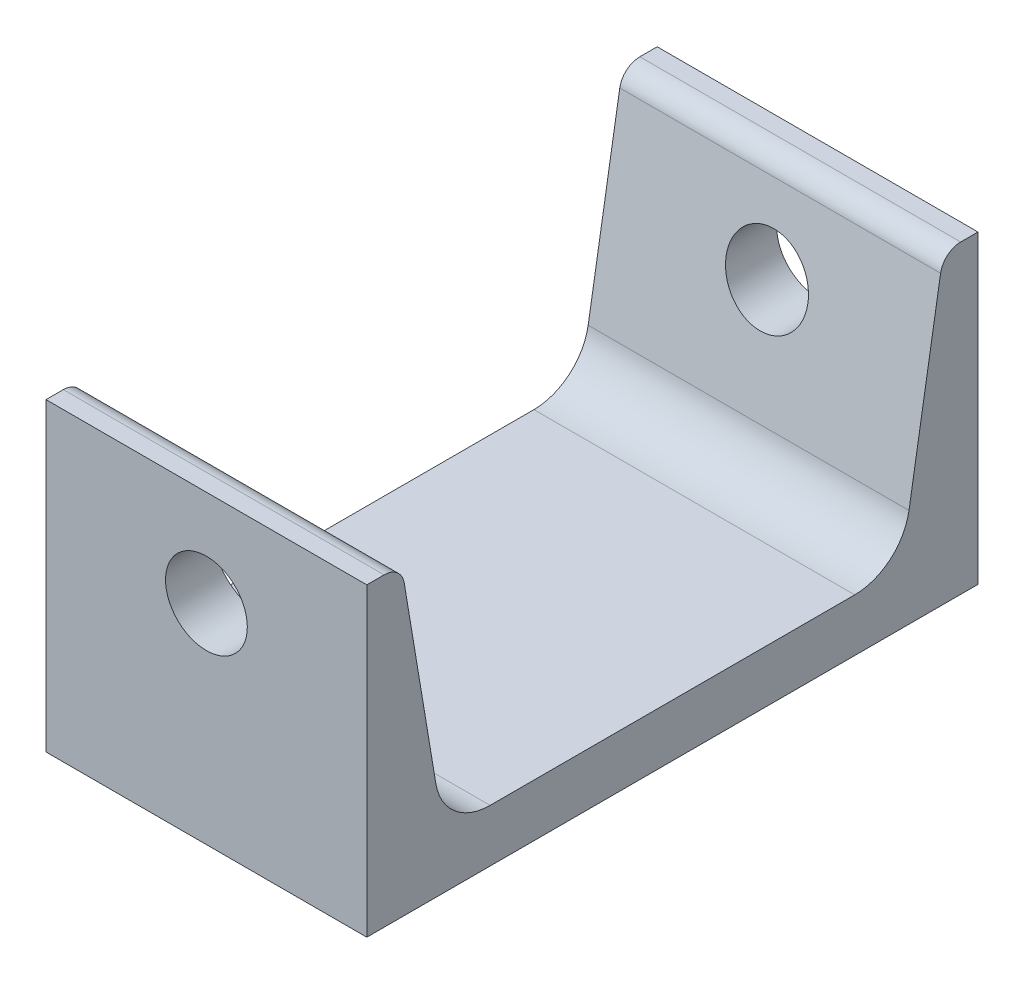
ISO-10303-21;
HEADER;
FILE_DESCRIPTION(('STEP AP214'),'2;1');
FILE_NAME('part.step','',(''),(''),'','','');
FILE_SCHEMA(('AUTOMOTIVE_DESIGN { 1 0 10303 214 1 1 1 1 }'));
ENDSEC;
DATA;
#1=APPLICATION_CONTEXT('core data for automotive mechanical design processes');
#2=APPLICATION_PROTOCOL_DEFINITION('international standard','automotive_design',2000,#1);
#3=PRODUCT_CONTEXT('',#1,'mechanical');
#4=PRODUCT('Part','Part','',(#3));
#5=PRODUCT_RELATED_PRODUCT_CATEGORY('part','',(#4));
#6=PRODUCT_DEFINITION_FORMATION('','',#4);
#7=PRODUCT_DEFINITION_CONTEXT('part definition',#1,'design');
#8=PRODUCT_DEFINITION('design','',#6,#7);
#9=PRODUCT_DEFINITION_SHAPE('','',#8);
#10=(LENGTH_UNIT() NAMED_UNIT(*) SI_UNIT(.MILLI.,.METRE.));
#11=(NAMED_UNIT(*) PLANE_ANGLE_UNIT() SI_UNIT($,.RADIAN.));
#12=(NAMED_UNIT(*) SI_UNIT($,.STERADIAN.) SOLID_ANGLE_UNIT());
#13=UNCERTAINTY_MEASURE_WITH_UNIT(LENGTH_MEASURE(1.E-05),#10,'distance_accuracy_value','');
#14=(GEOMETRIC_REPRESENTATION_CONTEXT(3) GLOBAL_UNCERTAINTY_ASSIGNED_CONTEXT((#13)) GLOBAL_UNIT_ASSIGNED_CONTEXT((#10,
#11,#12)) REPRESENTATION_CONTEXT('',''));
#15=CARTESIAN_POINT('',(0.,0.,0.));
#16=DIRECTION('',(0.,0.,1.));
#17=DIRECTION('',(1.,0.,0.));
#18=AXIS2_PLACEMENT_3D('',#15,#16,#17);
#19=CARTESIAN_POINT('',(21.463345864662,0.,-38.1));
#20=DIRECTION('',(0.,0.,1.));
#21=DIRECTION('',(1.,0.,0.));
#22=AXIS2_PLACEMENT_3D('',#19,#20,#21);
#23=PLANE('',#22);
#24=CARTESIAN_POINT('',(1.46334586466201,26.0492,-38.1));
#25=DIRECTION('',(0.,0.,1.));
#26=DIRECTION('',(1.,0.,0.));
#27=AXIS2_PLACEMENT_3D('',#24,#25,#26);
#28=CIRCLE('',#27,5.1);
#29=CARTESIAN_POINT('',(6.56334586466201,26.0492,-38.1));
#30=VERTEX_POINT('',#29);
#31=EDGE_CURVE('E308',#30,#30,#28,.T.);
#32=ORIENTED_EDGE('',*,*,#31,.T.);
#33=EDGE_LOOP('',(#32));
#34=FACE_BOUND('',#33,.T.);
#35=DIRECTION('',(0.,1.,0.));
#36=VECTOR('',#35,1.);
#37=CARTESIAN_POINT('',(-18.5366541353384,0.,-38.1));
#38=LINE('',#37,#36);
#39=CARTESIAN_POINT('',(-18.5366541353384,0.,-38.1));
#40=VERTEX_POINT('',#39);
#41=CARTESIAN_POINT('',(-18.5366541353384,38.0492,-38.1));
#42=VERTEX_POINT('',#41);
#43=EDGE_CURVE('E199',#40,#42,#38,.T.);
#44=ORIENTED_EDGE('',*,*,#43,.T.);
#45=DIRECTION('',(-1.,0.,0.));
#46=VECTOR('',#45,1.);
#47=CARTESIAN_POINT('',(21.463345864662,38.0492,-38.1));
#48=LINE('',#47,#46);
#49=CARTESIAN_POINT('',(21.463345864662,38.0492,-38.1));
#50=VERTEX_POINT('',#49);
#51=EDGE_CURVE('E13',#50,#42,#48,.T.);
#52=ORIENTED_EDGE('',*,*,#51,.F.);
#53=DIRECTION('',(0.,1.,0.));
#54=VECTOR('',#53,1.);
#55=CARTESIAN_POINT('',(21.463345864662,0.,-38.1));
#56=LINE('',#55,#54);
#57=CARTESIAN_POINT('',(21.463345864662,0.,-38.1));
#58=VERTEX_POINT('',#57);
#59=EDGE_CURVE('E222',#58,#50,#56,.T.);
#60=ORIENTED_EDGE('',*,*,#59,.F.);
#61=DIRECTION('',(-1.,0.,0.));
#62=VECTOR('',#61,1.);
#63=CARTESIAN_POINT('',(21.463345864662,0.,-38.1));
#64=LINE('',#63,#62);
#65=EDGE_CURVE('E195',#58,#40,#64,.T.);
#66=ORIENTED_EDGE('',*,*,#65,.T.);
#67=EDGE_LOOP('',(#44,#52,#60,#66));
#68=FACE_BOUND('',#67,.T.);
#69=ADVANCED_FACE('F79',(#34,#68),#23,.F.);
#70=CARTESIAN_POINT('',(21.463345864662,38.0492,-38.1));
#71=DIRECTION('',(0.,-1.,0.));
#72=DIRECTION('',(0.,0.,-1.));
#73=AXIS2_PLACEMENT_3D('',#70,#71,#72);
#74=PLANE('',#73);
#75=DIRECTION('',(0.,0.,1.));
#76=VECTOR('',#75,1.);
#77=CARTESIAN_POINT('',(-18.5366541353384,38.0492,-38.1));
#78=LINE('',#77,#76);
#79=CARTESIAN_POINT('',(-18.5366541353384,38.0492,-35.942335135838));
#80=VERTEX_POINT('',#79);
#81=EDGE_CURVE('E202',#42,#80,#78,.T.);
#82=ORIENTED_EDGE('',*,*,#81,.T.);
#83=DIRECTION('',(-1.,0.,0.));
#84=VECTOR('',#83,1.);
#85=CARTESIAN_POINT('',(21.463345864662,38.0492,-35.942335135838));
#86=LINE('',#85,#84);
#87=CARTESIAN_POINT('',(21.463345864662,38.0492,-35.942335135838));
#88=VERTEX_POINT('',#87);
#89=EDGE_CURVE('E87',#88,#80,#86,.T.);
#90=ORIENTED_EDGE('',*,*,#89,.F.);
#91=DIRECTION('',(0.,0.,1.));
#92=VECTOR('',#91,1.);
#93=CARTESIAN_POINT('',(21.463345864662,38.0492,-38.1));
#94=LINE('',#93,#92);
#95=EDGE_CURVE('E150',#50,#88,#94,.T.);
#96=ORIENTED_EDGE('',*,*,#95,.F.);
#97=ORIENTED_EDGE('',*,*,#51,.T.);
#98=EDGE_LOOP('',(#82,#90,#96,#97));
#99=FACE_BOUND('',#98,.T.);
#100=ADVANCED_FACE('F301',(#99),#74,.F.);
#101=CARTESIAN_POINT('',(21.463345864662,35.5092,-35.942335135838));
#102=DIRECTION('',(-1.,0.,0.));
#103=DIRECTION('',(0.,0.,1.));
#104=AXIS2_PLACEMENT_3D('',#101,#102,#103);
#105=CYLINDRICAL_SURFACE('',#104,2.54);
#106=CARTESIAN_POINT('',(-18.5366541353384,35.5092,-35.942335135838));
#107=DIRECTION('',(1.,0.,0.));
#108=DIRECTION('',(0.,0.,-1.));
#109=AXIS2_PLACEMENT_3D('',#106,#107,#108);
#110=CIRCLE('',#109,2.54);
#111=CARTESIAN_POINT('',(-18.5366541353384,35.9268030663407,-33.4368995092487));
#112=VERTEX_POINT('',#111);
#113=EDGE_CURVE('E205',#80,#112,#110,.T.);
#114=ORIENTED_EDGE('',*,*,#113,.T.);
#115=DIRECTION('',(-1.,0.,0.));
#116=VECTOR('',#115,1.);
#117=CARTESIAN_POINT('',(21.463345864662,35.9268030663407,-33.4368995092487));
#118=LINE('',#117,#116);
#119=CARTESIAN_POINT('',(21.463345864662,35.9268030663407,-33.4368995092487));
#120=VERTEX_POINT('',#119);
#121=EDGE_CURVE('E241',#120,#112,#118,.T.);
#122=ORIENTED_EDGE('',*,*,#121,.F.);
#123=CARTESIAN_POINT('',(21.463345864662,35.5092,-35.942335135838));
#124=DIRECTION('',(1.,0.,0.));
#125=DIRECTION('',(0.,0.,-1.));
#126=AXIS2_PLACEMENT_3D('',#123,#124,#125);
#127=CIRCLE('',#126,2.54);
#128=EDGE_CURVE('E249',#88,#120,#127,.T.);
#129=ORIENTED_EDGE('',*,*,#128,.F.);
#130=ORIENTED_EDGE('',*,*,#89,.T.);
#131=EDGE_LOOP('',(#114,#122,#129,#130));
#132=FACE_BOUND('',#131,.T.);
#133=ADVANCED_FACE('F247',(#132),#105,.T.);
#134=CARTESIAN_POINT('',(21.463345864662,12.2836717208802,-29.4960901573836));
#135=DIRECTION('',(0.,-0.164410656039629,-0.986391978972162));
#136=DIRECTION('',(0.,0.986391978972162,-0.164410656039629));
#137=AXIS2_PLACEMENT_3D('',#134,#135,#136);
#138=PLANE('',#137);
#139=CARTESIAN_POINT('',(1.46334586466201,26.0492,-31.7905122363835));
#140=DIRECTION('',(0.,-0.164410656039629,-0.986391978972162));
#141=DIRECTION('',(0.,-0.986391978972162,0.164410656039629));
#142=AXIS2_PLACEMENT_3D('',#139,#140,#141);
#143=ELLIPSE('',#142,5.17035834508132,5.1);
#144=CARTESIAN_POINT('',(1.46334586466201,20.9492,-30.9404502289087));
#145=VERTEX_POINT('',#144);
#146=EDGE_CURVE('E203',#145,#145,#143,.T.);
#147=ORIENTED_EDGE('',*,*,#146,.T.);
#148=EDGE_LOOP('',(#147));
#149=FACE_BOUND('',#148,.T.);
#150=DIRECTION('',(0.,-0.986391978972162,0.164410656039629));
#151=VECTOR('',#150,1.);
#152=CARTESIAN_POINT('',(-18.5366541353384,12.2836717208802,-29.4960901573836));
#153=LINE('',#152,#151);
#154=CARTESIAN_POINT('',(-18.5366541353384,12.2836717208802,-29.4960901573836));
#155=VERTEX_POINT('',#154);
#156=EDGE_CURVE('E207',#112,#155,#153,.T.);
#157=ORIENTED_EDGE('',*,*,#156,.T.);
#158=DIRECTION('',(-1.,0.,0.));
#159=VECTOR('',#158,1.);
#160=CARTESIAN_POINT('',(21.463345864662,12.2836717208802,-29.4960901573836));
#161=LINE('',#160,#159);
#162=CARTESIAN_POINT('',(21.463345864662,12.2836717208802,-29.4960901573836));
#163=VERTEX_POINT('',#162);
#164=EDGE_CURVE('E238',#163,#155,#161,.T.);
#165=ORIENTED_EDGE('',*,*,#164,.F.);
#166=DIRECTION('',(0.,-0.986391978972162,0.164410656039629));
#167=VECTOR('',#166,1.);
#168=CARTESIAN_POINT('',(21.463345864662,12.2836717208802,-29.4960901573836));
#169=LINE('',#168,#167);
#170=EDGE_CURVE('E267',#120,#163,#169,.T.);
#171=ORIENTED_EDGE('',*,*,#170,.F.);
#172=ORIENTED_EDGE('',*,*,#121,.T.);
#173=EDGE_LOOP('',(#157,#165,#171,#172));
#174=FACE_BOUND('',#173,.T.);
#175=ADVANCED_FACE('F258',(#149,#174),#138,.F.);
#176=CARTESIAN_POINT('',(21.463345864662,13.4112,-22.7314139655925));
#177=DIRECTION('',(-1.,0.,0.));
#178=DIRECTION('',(0.,0.,1.));
#179=AXIS2_PLACEMENT_3D('',#176,#177,#178);
#180=CYLINDRICAL_SURFACE('',#179,6.85800000000001);
#181=CARTESIAN_POINT('',(-18.5366541353384,13.4112,-22.7314139655925));
#182=DIRECTION('',(-1.,0.,0.));
#183=DIRECTION('',(0.,0.,-1.));
#184=AXIS2_PLACEMENT_3D('',#181,#182,#183);
#185=CIRCLE('',#184,6.85800000000001);
#186=CARTESIAN_POINT('',(-18.5366541353384,6.55320000000001,-22.7314139655925));
#187=VERTEX_POINT('',#186);
#188=EDGE_CURVE('E209',#155,#187,#185,.T.);
#189=ORIENTED_EDGE('',*,*,#188,.T.);
#190=DIRECTION('',(-1.,0.,0.));
#191=VECTOR('',#190,1.);
#192=CARTESIAN_POINT('',(21.463345864662,6.55320000000001,-22.7314139655925));
#193=LINE('',#192,#191);
#194=CARTESIAN_POINT('',(21.463345864662,6.55320000000001,-22.7314139655925));
#195=VERTEX_POINT('',#194);
#196=EDGE_CURVE('E235',#195,#187,#193,.T.);
#197=ORIENTED_EDGE('',*,*,#196,.F.);
#198=CARTESIAN_POINT('',(21.463345864662,13.4112,-22.7314139655925));
#199=DIRECTION('',(-1.,0.,0.));
#200=DIRECTION('',(0.,0.,-1.));
#201=AXIS2_PLACEMENT_3D('',#198,#199,#200);
#202=CIRCLE('',#201,6.85800000000001);
#203=EDGE_CURVE('E264',#163,#195,#202,.T.);
#204=ORIENTED_EDGE('',*,*,#203,.F.);
#205=ORIENTED_EDGE('',*,*,#164,.T.);
#206=EDGE_LOOP('',(#189,#197,#204,#205));
#207=FACE_BOUND('',#206,.T.);
#208=ADVANCED_FACE('F262',(#207),#180,.F.);
#209=CARTESIAN_POINT('',(21.463345864662,6.55320000000001,22.7314139655925));
#210=DIRECTION('',(0.,-1.,0.));
#211=DIRECTION('',(0.,0.,-1.));
#212=AXIS2_PLACEMENT_3D('',#209,#210,#211);
#213=PLANE('',#212);
#214=DIRECTION('',(0.,0.,1.));
#215=VECTOR('',#214,1.);
#216=CARTESIAN_POINT('',(-18.5366541353384,6.55320000000001,22.7314139655925));
#217=LINE('',#216,#215);
#218=CARTESIAN_POINT('',(-18.5366541353384,6.5532,22.7314139655925));
#219=VERTEX_POINT('',#218);
#220=EDGE_CURVE('E211',#187,#219,#217,.T.);
#221=ORIENTED_EDGE('',*,*,#220,.T.);
#222=DIRECTION('',(-1.,0.,0.));
#223=VECTOR('',#222,1.);
#224=CARTESIAN_POINT('',(21.463345864662,6.5532,22.7314139655925));
#225=LINE('',#224,#223);
#226=CARTESIAN_POINT('',(21.463345864662,6.5532,22.7314139655925));
#227=VERTEX_POINT('',#226);
#228=EDGE_CURVE('E232',#227,#219,#225,.T.);
#229=ORIENTED_EDGE('',*,*,#228,.F.);
#230=DIRECTION('',(0.,0.,1.));
#231=VECTOR('',#230,1.);
#232=CARTESIAN_POINT('',(21.463345864662,6.55320000000001,22.7314139655925));
#233=LINE('',#232,#231);
#234=EDGE_CURVE('E266',#195,#227,#233,.T.);
#235=ORIENTED_EDGE('',*,*,#234,.F.);
#236=ORIENTED_EDGE('',*,*,#196,.T.);
#237=EDGE_LOOP('',(#221,#229,#235,#236));
#238=FACE_BOUND('',#237,.T.);
#239=ADVANCED_FACE('F412',(#238),#213,.F.);
#240=CARTESIAN_POINT('',(21.463345864662,13.4112,22.7314139655925));
#241=DIRECTION('',(-1.,0.,0.));
#242=DIRECTION('',(0.,0.,1.));
#243=AXIS2_PLACEMENT_3D('',#240,#241,#242);
#244=CYLINDRICAL_SURFACE('',#243,6.85800000000001);
#245=CARTESIAN_POINT('',(-18.5366541353384,13.4112,22.7314139655925));
#246=DIRECTION('',(-1.,0.,0.));
#247=DIRECTION('',(0.,0.,1.));
#248=AXIS2_PLACEMENT_3D('',#245,#246,#247);
#249=CIRCLE('',#248,6.85800000000001);
#250=CARTESIAN_POINT('',(-18.5366541353384,12.2836717208802,29.4960901573836));
#251=VERTEX_POINT('',#250);
#252=EDGE_CURVE('E213',#219,#251,#249,.T.);
#253=ORIENTED_EDGE('',*,*,#252,.T.);
#254=DIRECTION('',(-1.,0.,0.));
#255=VECTOR('',#254,1.);
#256=CARTESIAN_POINT('',(21.463345864662,12.2836717208802,29.4960901573836));
#257=LINE('',#256,#255);
#258=CARTESIAN_POINT('',(21.463345864662,12.2836717208802,29.4960901573836));
#259=VERTEX_POINT('',#258);
#260=EDGE_CURVE('E229',#259,#251,#257,.T.);
#261=ORIENTED_EDGE('',*,*,#260,.F.);
#262=CARTESIAN_POINT('',(21.463345864662,13.4112,22.7314139655925));
#263=DIRECTION('',(-1.,0.,0.));
#264=DIRECTION('',(0.,0.,1.));
#265=AXIS2_PLACEMENT_3D('',#262,#263,#264);
#266=CIRCLE('',#265,6.85800000000001);
#267=EDGE_CURVE('E269',#227,#259,#266,.T.);
#268=ORIENTED_EDGE('',*,*,#267,.F.);
#269=ORIENTED_EDGE('',*,*,#228,.T.);
#270=EDGE_LOOP('',(#253,#261,#268,#269));
#271=FACE_BOUND('',#270,.T.);
#272=ADVANCED_FACE('F364',(#271),#244,.F.);
#273=CARTESIAN_POINT('',(21.463345864662,12.2836717208802,29.4960901573836));
#274=DIRECTION('',(0.,-0.164410656039629,0.986391978972162));
#275=DIRECTION('',(0.,-0.986391978972162,-0.164410656039629));
#276=AXIS2_PLACEMENT_3D('',#273,#274,#275);
#277=PLANE('',#276);
#278=CARTESIAN_POINT('',(1.46334586466201,26.0492,31.7905122363835));
#279=DIRECTION('',(0.,-0.164410656039629,0.986391978972162));
#280=DIRECTION('',(0.,0.986391978972162,0.164410656039629));
#281=AXIS2_PLACEMENT_3D('',#278,#279,#280);
#282=ELLIPSE('',#281,5.17035834508132,5.1);
#283=CARTESIAN_POINT('',(1.46334586466201,31.1492,32.6405742438583));
#284=VERTEX_POINT('',#283);
#285=EDGE_CURVE('E310',#284,#284,#282,.T.);
#286=ORIENTED_EDGE('',*,*,#285,.T.);
#287=EDGE_LOOP('',(#286));
#288=FACE_BOUND('',#287,.T.);
#289=DIRECTION('',(0.,0.986391978972162,0.164410656039629));
#290=VECTOR('',#289,1.);
#291=CARTESIAN_POINT('',(-18.5366541353384,12.2836717208802,29.4960901573836));
#292=LINE('',#291,#290);
#293=CARTESIAN_POINT('',(-18.5366541353384,35.9268030663407,33.4368995092487));
#294=VERTEX_POINT('',#293);
#295=EDGE_CURVE('E215',#251,#294,#292,.T.);
#296=ORIENTED_EDGE('',*,*,#295,.T.);
#297=DIRECTION('',(-1.,0.,0.));
#298=VECTOR('',#297,1.);
#299=CARTESIAN_POINT('',(21.463345864662,35.9268030663407,33.4368995092487));
#300=LINE('',#299,#298);
#301=CARTESIAN_POINT('',(21.463345864662,35.9268030663407,33.4368995092487));
#302=VERTEX_POINT('',#301);
#303=EDGE_CURVE('E226',#302,#294,#300,.T.);
#304=ORIENTED_EDGE('',*,*,#303,.F.);
#305=DIRECTION('',(0.,0.986391978972162,0.164410656039629));
#306=VECTOR('',#305,1.);
#307=CARTESIAN_POINT('',(21.463345864662,12.2836717208802,29.4960901573836));
#308=LINE('',#307,#306);
#309=EDGE_CURVE('E275',#259,#302,#308,.T.);
#310=ORIENTED_EDGE('',*,*,#309,.F.);
#311=ORIENTED_EDGE('',*,*,#260,.T.);
#312=EDGE_LOOP('',(#296,#304,#310,#311));
#313=FACE_BOUND('',#312,.T.);
#314=ADVANCED_FACE('F281',(#288,#313),#277,.F.);
#315=CARTESIAN_POINT('',(21.463345864662,35.5092,35.942335135838));
#316=DIRECTION('',(-1.,0.,0.));
#317=DIRECTION('',(0.,0.,1.));
#318=AXIS2_PLACEMENT_3D('',#315,#316,#317);
#319=CYLINDRICAL_SURFACE('',#318,2.54);
#320=CARTESIAN_POINT('',(-18.5366541353384,35.5092,35.942335135838));
#321=DIRECTION('',(1.,0.,0.));
#322=DIRECTION('',(0.,0.,1.));
#323=AXIS2_PLACEMENT_3D('',#320,#321,#322);
#324=CIRCLE('',#323,2.54);
#325=CARTESIAN_POINT('',(-18.5366541353384,38.0492,35.942335135838));
#326=VERTEX_POINT('',#325);
#327=EDGE_CURVE('E217',#294,#326,#324,.T.);
#328=ORIENTED_EDGE('',*,*,#327,.T.);
#329=DIRECTION('',(-1.,0.,0.));
#330=VECTOR('',#329,1.);
#331=CARTESIAN_POINT('',(21.463345864662,38.0492,35.942335135838));
#332=LINE('',#331,#330);
#333=CARTESIAN_POINT('',(21.463345864662,38.0492,35.942335135838));
#334=VERTEX_POINT('',#333);
#335=EDGE_CURVE('E190',#334,#326,#332,.T.);
#336=ORIENTED_EDGE('',*,*,#335,.F.);
#337=CARTESIAN_POINT('',(21.463345864662,35.5092,35.942335135838));
#338=DIRECTION('',(1.,0.,0.));
#339=DIRECTION('',(0.,0.,1.));
#340=AXIS2_PLACEMENT_3D('',#337,#338,#339);
#341=CIRCLE('',#340,2.54);
#342=EDGE_CURVE('E181',#302,#334,#341,.T.);
#343=ORIENTED_EDGE('',*,*,#342,.F.);
#344=ORIENTED_EDGE('',*,*,#303,.T.);
#345=EDGE_LOOP('',(#328,#336,#343,#344));
#346=FACE_BOUND('',#345,.T.);
#347=ADVANCED_FACE('F285',(#346),#319,.T.);
#348=CARTESIAN_POINT('',(21.463345864662,38.0492,38.1));
#349=DIRECTION('',(0.,-1.,0.));
#350=DIRECTION('',(0.,0.,-1.));
#351=AXIS2_PLACEMENT_3D('',#348,#349,#350);
#352=PLANE('',#351);
#353=DIRECTION('',(0.,0.,1.));
#354=VECTOR('',#353,1.);
#355=CARTESIAN_POINT('',(-18.5366541353384,38.0492,38.1));
#356=LINE('',#355,#354);
#357=CARTESIAN_POINT('',(-18.5366541353384,38.0492,38.1));
#358=VERTEX_POINT('',#357);
#359=EDGE_CURVE('E189',#326,#358,#356,.T.);
#360=ORIENTED_EDGE('',*,*,#359,.T.);
#361=DIRECTION('',(-1.,0.,0.));
#362=VECTOR('',#361,1.);
#363=CARTESIAN_POINT('',(21.463345864662,38.0492,38.1));
#364=LINE('',#363,#362);
#365=CARTESIAN_POINT('',(21.463345864662,38.0492,38.1));
#366=VERTEX_POINT('',#365);
#367=EDGE_CURVE('E186',#366,#358,#364,.T.);
#368=ORIENTED_EDGE('',*,*,#367,.F.);
#369=DIRECTION('',(0.,0.,1.));
#370=VECTOR('',#369,1.);
#371=CARTESIAN_POINT('',(21.463345864662,38.0492,38.1));
#372=LINE('',#371,#370);
#373=EDGE_CURVE('E175',#334,#366,#372,.T.);
#374=ORIENTED_EDGE('',*,*,#373,.F.);
#375=ORIENTED_EDGE('',*,*,#335,.T.);
#376=EDGE_LOOP('',(#360,#368,#374,#375));
#377=FACE_BOUND('',#376,.T.);
#378=ADVANCED_FACE('F187',(#377),#352,.F.);
#379=CARTESIAN_POINT('',(21.463345864662,0.,38.1));
#380=DIRECTION('',(0.,0.,-1.));
#381=DIRECTION('',(-1.,0.,0.));
#382=AXIS2_PLACEMENT_3D('',#379,#380,#381);
#383=PLANE('',#382);
#384=CARTESIAN_POINT('',(1.46334586466201,26.0492,38.1));
#385=DIRECTION('',(0.,0.,1.));
#386=DIRECTION('',(1.,0.,0.));
#387=AXIS2_PLACEMENT_3D('',#384,#385,#386);
#388=CIRCLE('',#387,5.1);
#389=CARTESIAN_POINT('',(6.56334586466201,26.0492,38.1));
#390=VERTEX_POINT('',#389);
#391=EDGE_CURVE('E311',#390,#390,#388,.T.);
#392=ORIENTED_EDGE('',*,*,#391,.F.);
#393=EDGE_LOOP('',(#392));
#394=FACE_BOUND('',#393,.T.);
#395=DIRECTION('',(0.,-1.,0.));
#396=VECTOR('',#395,1.);
#397=CARTESIAN_POINT('',(-18.5366541353384,0.,38.1));
#398=LINE('',#397,#396);
#399=CARTESIAN_POINT('',(-18.5366541353384,0.,38.1));
#400=VERTEX_POINT('',#399);
#401=EDGE_CURVE('E136',#358,#400,#398,.T.);
#402=ORIENTED_EDGE('',*,*,#401,.T.);
#403=DIRECTION('',(-1.,0.,0.));
#404=VECTOR('',#403,1.);
#405=CARTESIAN_POINT('',(21.463345864662,0.,38.1));
#406=LINE('',#405,#404);
#407=CARTESIAN_POINT('',(21.463345864662,0.,38.1));
#408=VERTEX_POINT('',#407);
#409=EDGE_CURVE('E191',#408,#400,#406,.T.);
#410=ORIENTED_EDGE('',*,*,#409,.F.);
#411=DIRECTION('',(0.,-1.,0.));
#412=VECTOR('',#411,1.);
#413=CARTESIAN_POINT('',(21.463345864662,0.,38.1));
#414=LINE('',#413,#412);
#415=EDGE_CURVE('E179',#366,#408,#414,.T.);
#416=ORIENTED_EDGE('',*,*,#415,.F.);
#417=ORIENTED_EDGE('',*,*,#367,.T.);
#418=EDGE_LOOP('',(#402,#410,#416,#417));
#419=FACE_BOUND('',#418,.T.);
#420=ADVANCED_FACE('F193',(#394,#419),#383,.F.);
#421=CARTESIAN_POINT('',(21.463345864662,0.,-38.1));
#422=DIRECTION('',(0.,1.,0.));
#423=DIRECTION('',(0.,0.,1.));
#424=AXIS2_PLACEMENT_3D('',#421,#422,#423);
#425=PLANE('',#424);
#426=DIRECTION('',(0.,0.,-1.));
#427=VECTOR('',#426,1.);
#428=CARTESIAN_POINT('',(-18.5366541353384,0.,-38.1));
#429=LINE('',#428,#427);
#430=EDGE_CURVE('E142',#400,#40,#429,.T.);
#431=ORIENTED_EDGE('',*,*,#430,.T.);
#432=ORIENTED_EDGE('',*,*,#65,.F.);
#433=DIRECTION('',(0.,0.,-1.));
#434=VECTOR('',#433,1.);
#435=CARTESIAN_POINT('',(21.463345864662,0.,-38.1));
#436=LINE('',#435,#434);
#437=EDGE_CURVE('E95',#408,#58,#436,.T.);
#438=ORIENTED_EDGE('',*,*,#437,.F.);
#439=ORIENTED_EDGE('',*,*,#409,.T.);
#440=EDGE_LOOP('',(#431,#432,#438,#439));
#441=FACE_BOUND('',#440,.T.);
#442=ADVANCED_FACE('F289',(#441),#425,.F.);
#443=CARTESIAN_POINT('',(21.463345864662,35.5092,-35.942335135838));
#444=DIRECTION('',(1.,0.,0.));
#445=DIRECTION('',(0.,0.,-1.));
#446=AXIS2_PLACEMENT_3D('',#443,#444,#445);
#447=PLANE('',#446);
#448=ORIENTED_EDGE('',*,*,#59,.T.);
#449=ORIENTED_EDGE('',*,*,#95,.T.);
#450=ORIENTED_EDGE('',*,*,#128,.T.);
#451=ORIENTED_EDGE('',*,*,#170,.T.);
#452=ORIENTED_EDGE('',*,*,#203,.T.);
#453=ORIENTED_EDGE('',*,*,#234,.T.);
#454=ORIENTED_EDGE('',*,*,#267,.T.);
#455=ORIENTED_EDGE('',*,*,#309,.T.);
#456=ORIENTED_EDGE('',*,*,#342,.T.);
#457=ORIENTED_EDGE('',*,*,#373,.T.);
#458=ORIENTED_EDGE('',*,*,#415,.T.);
#459=ORIENTED_EDGE('',*,*,#437,.T.);
#460=EDGE_LOOP('',(#448,#449,#450,#451,#452,#453,#454,#455,#456,#457,#458,#459));
#461=FACE_BOUND('',#460,.T.);
#462=ADVANCED_FACE('F177',(#461),#447,.T.);
#463=CARTESIAN_POINT('',(-18.5366541353384,35.5092,-35.942335135838));
#464=DIRECTION('',(1.,0.,0.));
#465=DIRECTION('',(0.,0.,-1.));
#466=AXIS2_PLACEMENT_3D('',#463,#464,#465);
#467=PLANE('',#466);
#468=ORIENTED_EDGE('',*,*,#43,.F.);
#469=ORIENTED_EDGE('',*,*,#430,.F.);
#470=ORIENTED_EDGE('',*,*,#401,.F.);
#471=ORIENTED_EDGE('',*,*,#359,.F.);
#472=ORIENTED_EDGE('',*,*,#327,.F.);
#473=ORIENTED_EDGE('',*,*,#295,.F.);
#474=ORIENTED_EDGE('',*,*,#252,.F.);
#475=ORIENTED_EDGE('',*,*,#220,.F.);
#476=ORIENTED_EDGE('',*,*,#188,.F.);
#477=ORIENTED_EDGE('',*,*,#156,.F.);
#478=ORIENTED_EDGE('',*,*,#113,.F.);
#479=ORIENTED_EDGE('',*,*,#81,.F.);
#480=EDGE_LOOP('',(#468,#469,#470,#471,#472,#473,#474,#475,#476,#477,#478,#479));
#481=FACE_BOUND('',#480,.T.);
#482=ADVANCED_FACE('F253',(#481),#467,.F.);
#483=CARTESIAN_POINT('',(1.46334586466201,26.0492,-38.1));
#484=DIRECTION('',(0.,0.,1.));
#485=DIRECTION('',(1.,0.,0.));
#486=AXIS2_PLACEMENT_3D('',#483,#484,#485);
#487=CYLINDRICAL_SURFACE('',#486,5.1);
#488=ORIENTED_EDGE('',*,*,#391,.T.);
#489=EDGE_LOOP('',(#488));
#490=FACE_BOUND('',#489,.T.);
#491=ORIENTED_EDGE('',*,*,#285,.F.);
#492=EDGE_LOOP('',(#491));
#493=FACE_BOUND('',#492,.T.);
#494=ADVANCED_FACE('F326',(#490,#493),#487,.F.);
#495=ORIENTED_EDGE('',*,*,#31,.F.);
#496=EDGE_LOOP('',(#495));
#497=FACE_BOUND('',#496,.T.);
#498=ORIENTED_EDGE('',*,*,#146,.F.);
#499=EDGE_LOOP('',(#498));
#500=FACE_BOUND('',#499,.T.);
#501=ADVANCED_FACE('F324',(#497,#500),#487,.F.);
#502=CLOSED_SHELL('',(#69,#100,#133,#175,#208,#239,#272,#314,#347,#378,#420,#442,#462,#482,#494,#501));
#503=MANIFOLD_SOLID_BREP('B2',#502);
#504=ADVANCED_BREP_SHAPE_REPRESENTATION('',(#18,#503),#14);
#505=SHAPE_DEFINITION_REPRESENTATION(#9,#504);
ENDSEC;
END-ISO-10303-21;
